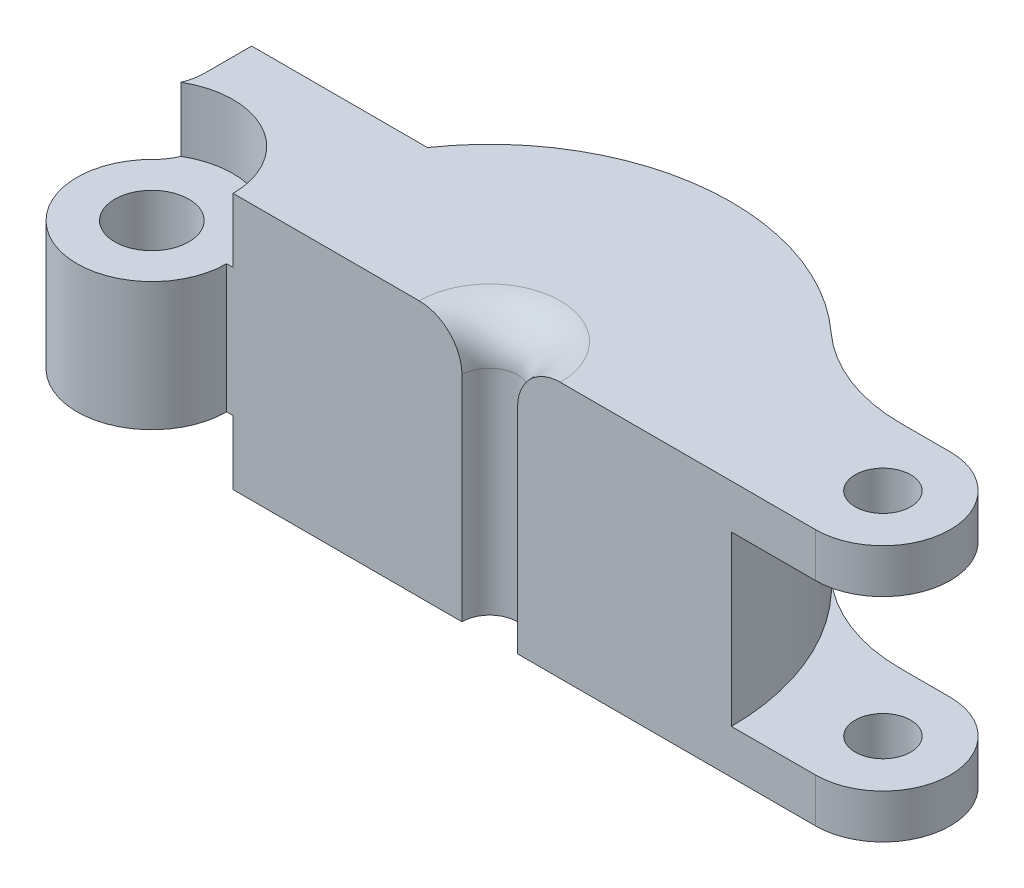
ISO-10303-21;
HEADER;
FILE_DESCRIPTION(('STEP AP214'),'2;1');
FILE_NAME('part.step','',(''),(''),'','','');
FILE_SCHEMA(('AUTOMOTIVE_DESIGN { 1 0 10303 214 1 1 1 1 }'));
ENDSEC;
DATA;
#1=APPLICATION_CONTEXT('core data for automotive mechanical design processes');
#2=APPLICATION_PROTOCOL_DEFINITION('international standard','automotive_design',2000,#1);
#3=PRODUCT_CONTEXT('',#1,'mechanical');
#4=PRODUCT('Part','Part','',(#3));
#5=PRODUCT_RELATED_PRODUCT_CATEGORY('part','',(#4));
#6=PRODUCT_DEFINITION_FORMATION('','',#4);
#7=PRODUCT_DEFINITION_CONTEXT('part definition',#1,'design');
#8=PRODUCT_DEFINITION('design','',#6,#7);
#9=PRODUCT_DEFINITION_SHAPE('','',#8);
#10=(LENGTH_UNIT() NAMED_UNIT(*) SI_UNIT(.MILLI.,.METRE.));
#11=(NAMED_UNIT(*) PLANE_ANGLE_UNIT() SI_UNIT($,.RADIAN.));
#12=(NAMED_UNIT(*) SI_UNIT($,.STERADIAN.) SOLID_ANGLE_UNIT());
#13=UNCERTAINTY_MEASURE_WITH_UNIT(LENGTH_MEASURE(1.E-05),#10,'distance_accuracy_value','');
#14=(GEOMETRIC_REPRESENTATION_CONTEXT(3) GLOBAL_UNCERTAINTY_ASSIGNED_CONTEXT((#13)) GLOBAL_UNIT_ASSIGNED_CONTEXT((#10,
#11,#12)) REPRESENTATION_CONTEXT('',''));
#15=CARTESIAN_POINT('',(0.,0.,0.));
#16=DIRECTION('',(0.,0.,1.));
#17=DIRECTION('',(1.,0.,0.));
#18=AXIS2_PLACEMENT_3D('',#15,#16,#17);
#19=CARTESIAN_POINT('',(19.351,15.24,-4.));
#20=DIRECTION('',(0.,-1.,0.));
#21=DIRECTION('',(0.,0.,-1.));
#22=AXIS2_PLACEMENT_3D('',#19,#20,#21);
#23=CYLINDRICAL_SURFACE('',#22,4.);
#24=CARTESIAN_POINT('',(19.351,2.62,-4.));
#25=DIRECTION('',(0.,1.,0.));
#26=DIRECTION('',(0.,0.,1.));
#27=AXIS2_PLACEMENT_3D('',#24,#25,#26);
#28=CIRCLE('',#27,4.);
#29=CARTESIAN_POINT('',(19.351,2.62,0.));
#30=VERTEX_POINT('',#29);
#31=CARTESIAN_POINT('',(19.351,2.62,-8.));
#32=VERTEX_POINT('',#31);
#33=EDGE_CURVE('E218',#30,#32,#28,.T.);
#34=ORIENTED_EDGE('',*,*,#33,.F.);
#35=DIRECTION('',(0.,-1.,0.));
#36=VECTOR('',#35,1.);
#37=CARTESIAN_POINT('',(19.351,15.24,0.));
#38=LINE('',#37,#36);
#39=CARTESIAN_POINT('',(19.351,0.,0.));
#40=VERTEX_POINT('',#39);
#41=EDGE_CURVE('E216',#30,#40,#38,.T.);
#42=ORIENTED_EDGE('',*,*,#41,.T.);
#43=CARTESIAN_POINT('',(19.351,0.,-4.));
#44=DIRECTION('',(0.,1.,0.));
#45=DIRECTION('',(0.,0.,1.));
#46=AXIS2_PLACEMENT_3D('',#43,#44,#45);
#47=CIRCLE('',#46,4.);
#48=CARTESIAN_POINT('',(19.351,0.,-8.));
#49=VERTEX_POINT('',#48);
#50=EDGE_CURVE('E302',#40,#49,#47,.T.);
#51=ORIENTED_EDGE('',*,*,#50,.T.);
#52=DIRECTION('',(0.,-1.,0.));
#53=VECTOR('',#52,1.);
#54=CARTESIAN_POINT('',(19.351,15.24,-8.));
#55=LINE('',#54,#53);
#56=EDGE_CURVE('E344',#32,#49,#55,.T.);
#57=ORIENTED_EDGE('',*,*,#56,.F.);
#58=EDGE_LOOP('',(#34,#42,#51,#57));
#59=FACE_BOUND('',#58,.T.);
#60=ADVANCED_FACE('F45',(#59),#23,.T.);
#61=CARTESIAN_POINT('',(0.,15.24,-8.));
#62=DIRECTION('',(0.,0.,1.));
#63=DIRECTION('',(1.,0.,0.));
#64=AXIS2_PLACEMENT_3D('',#61,#62,#63);
#65=PLANE('',#64);
#66=DIRECTION('',(-1.,0.,0.));
#67=VECTOR('',#66,1.);
#68=CARTESIAN_POINT('',(0.,0.,-8.));
#69=LINE('',#68,#67);
#70=CARTESIAN_POINT('',(16.4003414903471,0.,-8.));
#71=VERTEX_POINT('',#70);
#72=EDGE_CURVE('E306',#49,#71,#69,.T.);
#73=ORIENTED_EDGE('',*,*,#72,.T.);
#74=DIRECTION('',(0.,1.,0.));
#75=VECTOR('',#74,1.);
#76=CARTESIAN_POINT('',(16.4003414903471,2.62000000000001,-8.));
#77=LINE('',#76,#75);
#78=CARTESIAN_POINT('',(16.4003414903471,2.62,-8.));
#79=VERTEX_POINT('',#78);
#80=EDGE_CURVE('E419',#71,#79,#77,.T.);
#81=ORIENTED_EDGE('',*,*,#80,.T.);
#82=DIRECTION('',(-1.,0.,0.));
#83=VECTOR('',#82,1.);
#84=CARTESIAN_POINT('',(19.351,2.62,-8.));
#85=LINE('',#84,#83);
#86=EDGE_CURVE('E221',#32,#79,#85,.T.);
#87=ORIENTED_EDGE('',*,*,#86,.F.);
#88=ORIENTED_EDGE('',*,*,#56,.T.);
#89=EDGE_LOOP('',(#73,#81,#87,#88));
#90=FACE_BOUND('',#89,.T.);
#91=ADVANCED_FACE('F434',(#90),#65,.F.);
#92=CARTESIAN_POINT('',(19.351,15.24,-4.));
#93=DIRECTION('',(0.,-1.,0.));
#94=DIRECTION('',(0.,0.,-1.));
#95=AXIS2_PLACEMENT_3D('',#92,#93,#94);
#96=CYLINDRICAL_SURFACE('',#95,1.65);
#97=CARTESIAN_POINT('',(19.351,0.,-4.));
#98=DIRECTION('',(0.,1.,0.));
#99=DIRECTION('',(0.,0.,1.));
#100=AXIS2_PLACEMENT_3D('',#97,#98,#99);
#101=CIRCLE('',#100,1.65);
#102=CARTESIAN_POINT('',(19.351,0.,-5.65));
#103=VERTEX_POINT('',#102);
#104=EDGE_CURVE('E266',#103,#103,#101,.T.);
#105=CARTESIAN_POINT('',(19.351,2.62,-4.));
#106=DIRECTION('',(0.,1.,0.));
#107=DIRECTION('',(0.,0.,1.));
#108=AXIS2_PLACEMENT_3D('',#105,#106,#107);
#109=CIRCLE('',#108,1.65);
#110=CARTESIAN_POINT('',(19.351,2.62,-5.65));
#111=VERTEX_POINT('',#110);
#112=EDGE_CURVE('E200',#111,#111,#109,.T.);
#113=CARTESIAN_POINT('',(19.351,0.,-5.65));
#114=CARTESIAN_POINT('',(19.351,0.0272916666666668,-5.65));
#115=CARTESIAN_POINT('',(19.351,0.0545833333333336,-5.65));
#116=CARTESIAN_POINT('',(19.351,0.109166666666667,-5.65));
#117=CARTESIAN_POINT('',(19.351,0.136458333333334,-5.65));
#118=CARTESIAN_POINT('',(19.351,0.191041666666667,-5.65));
#119=CARTESIAN_POINT('',(19.351,0.218333333333333,-5.65));
#120=CARTESIAN_POINT('',(19.351,0.272916666666666,-5.65));
#121=CARTESIAN_POINT('',(19.351,0.300208333333333,-5.65));
#122=CARTESIAN_POINT('',(19.351,0.354791666666666,-5.65));
#123=CARTESIAN_POINT('',(19.351,0.382083333333333,-5.65));
#124=CARTESIAN_POINT('',(19.351,0.436666666666666,-5.65));
#125=CARTESIAN_POINT('',(19.351,0.463958333333332,-5.65));
#126=CARTESIAN_POINT('',(19.351,0.518541666666665,-5.65));
#127=CARTESIAN_POINT('',(19.351,0.545833333333332,-5.65));
#128=CARTESIAN_POINT('',(19.351,0.600416666666666,-5.65));
#129=CARTESIAN_POINT('',(19.351,0.627708333333333,-5.65));
#130=CARTESIAN_POINT('',(19.351,0.682291666666666,-5.65));
#131=CARTESIAN_POINT('',(19.351,0.709583333333333,-5.65));
#132=CARTESIAN_POINT('',(19.351,0.764166666666666,-5.65));
#133=CARTESIAN_POINT('',(19.351,0.791458333333333,-5.65));
#134=CARTESIAN_POINT('',(19.351,0.846041666666666,-5.65));
#135=CARTESIAN_POINT('',(19.351,0.873333333333332,-5.65));
#136=CARTESIAN_POINT('',(19.351,0.927916666666665,-5.65));
#137=CARTESIAN_POINT('',(19.351,0.955208333333332,-5.65));
#138=CARTESIAN_POINT('',(19.351,1.00979166666667,-5.65));
#139=CARTESIAN_POINT('',(19.351,1.03708333333333,-5.65));
#140=CARTESIAN_POINT('',(19.351,1.09166666666667,-5.65));
#141=CARTESIAN_POINT('',(19.351,1.11895833333333,-5.65));
#142=CARTESIAN_POINT('',(19.351,1.17354166666666,-5.65));
#143=CARTESIAN_POINT('',(19.351,1.20083333333333,-5.65));
#144=CARTESIAN_POINT('',(19.351,1.25541666666667,-5.65));
#145=CARTESIAN_POINT('',(19.351,1.28270833333333,-5.65));
#146=CARTESIAN_POINT('',(19.351,1.33729166666667,-5.65));
#147=CARTESIAN_POINT('',(19.351,1.36458333333333,-5.65));
#148=CARTESIAN_POINT('',(19.351,1.41916666666667,-5.65));
#149=CARTESIAN_POINT('',(19.351,1.44645833333333,-5.65));
#150=CARTESIAN_POINT('',(19.351,1.50104166666667,-5.65));
#151=CARTESIAN_POINT('',(19.351,1.52833333333333,-5.65));
#152=CARTESIAN_POINT('',(19.351,1.58291666666666,-5.65));
#153=CARTESIAN_POINT('',(19.351,1.61020833333333,-5.65));
#154=CARTESIAN_POINT('',(19.351,1.66479166666667,-5.65));
#155=CARTESIAN_POINT('',(19.351,1.69208333333333,-5.65));
#156=CARTESIAN_POINT('',(19.351,1.74666666666666,-5.65));
#157=CARTESIAN_POINT('',(19.351,1.77395833333333,-5.65));
#158=CARTESIAN_POINT('',(19.351,1.82854166666666,-5.65));
#159=CARTESIAN_POINT('',(19.351,1.85583333333333,-5.65));
#160=CARTESIAN_POINT('',(19.351,1.91041666666666,-5.65));
#161=CARTESIAN_POINT('',(19.351,1.93770833333333,-5.65));
#162=CARTESIAN_POINT('',(19.351,1.99229166666666,-5.65));
#163=CARTESIAN_POINT('',(19.351,2.01958333333333,-5.65));
#164=CARTESIAN_POINT('',(19.351,2.07416666666666,-5.65));
#165=CARTESIAN_POINT('',(19.351,2.10145833333333,-5.65));
#166=CARTESIAN_POINT('',(19.351,2.15604166666667,-5.65));
#167=CARTESIAN_POINT('',(19.351,2.18333333333333,-5.65));
#168=CARTESIAN_POINT('',(19.351,2.23791666666666,-5.65));
#169=CARTESIAN_POINT('',(19.351,2.26520833333333,-5.65));
#170=CARTESIAN_POINT('',(19.351,2.31979166666666,-5.65));
#171=CARTESIAN_POINT('',(19.351,2.34708333333333,-5.65));
#172=CARTESIAN_POINT('',(19.351,2.40166666666666,-5.65));
#173=CARTESIAN_POINT('',(19.351,2.42895833333333,-5.65));
#174=CARTESIAN_POINT('',(19.351,2.48354166666666,-5.65));
#175=CARTESIAN_POINT('',(19.351,2.51083333333333,-5.65));
#176=CARTESIAN_POINT('',(19.351,2.56541666666666,-5.65));
#177=CARTESIAN_POINT('',(19.351,2.59270833333333,-5.65));
#178=CARTESIAN_POINT('',(19.351,2.62,-5.65));
#179=B_SPLINE_CURVE_WITH_KNOTS('',3,(#113,#114,#115,#116,#117,#118,#119,#120,#121,#122,#123,
#124,#125,#126,#127,#128,#129,#130,#131,#132,#133,#134,#135,#136,#137,#138,#139,#140,#141,#142,
#143,#144,#145,#146,#147,#148,#149,#150,#151,#152,#153,#154,#155,#156,#157,#158,#159,#160,#161,
#162,#163,#164,#165,#166,#167,#168,#169,#170,#171,#172,#173,#174,#175,#176,#177,#178),
.UNSPECIFIED.,.F.,.F.,(4,2,2,2,2,2,2,2,2,2,2,2,2,2,2,2,2,2,2,2,2,2,2,2,2,2,2,2,2,2,2,2,4),(0.,
0.0818750000000004,0.163750000000001,0.245624999999999,0.3275,0.409375,0.491249999999999,
0.573124999999999,0.654999999999999,0.736875,0.81875,0.900624999999999,0.982499999999999,
1.064375,1.14625,1.228125,1.31,1.391875,1.47375,1.555625,1.6375,1.719375,1.80125,1.883125,1.965,
2.046875,2.12875,2.210625,2.2925,2.374375,2.45625,2.538125,2.62),.UNSPECIFIED.);
#180=EDGE_CURVE('BSEAM483',#103,#111,#179,.T.);
#181=ORIENTED_EDGE('',*,*,#104,.F.);
#182=ORIENTED_EDGE('',*,*,#112,.T.);
#183=ORIENTED_EDGE('',*,*,#180,.T.);
#184=ORIENTED_EDGE('',*,*,#180,.F.);
#185=EDGE_LOOP('',(#181,#183,#182,#184));
#186=FACE_BOUND('',#185,.T.);
#187=ADVANCED_FACE('F483',(#186),#96,.F.);
#188=CARTESIAN_POINT('',(-20.07,15.24,0.));
#189=DIRECTION('',(0.,-1.,0.));
#190=DIRECTION('',(0.,0.,-1.));
#191=AXIS2_PLACEMENT_3D('',#188,#189,#190);
#192=CYLINDRICAL_SURFACE('',#191,4.445);
#193=CARTESIAN_POINT('',(-20.07,11.43,0.));
#194=DIRECTION('',(0.,1.,0.));
#195=DIRECTION('',(0.,0.,1.));
#196=AXIS2_PLACEMENT_3D('',#193,#194,#195);
#197=CIRCLE('',#196,4.445);
#198=CARTESIAN_POINT('',(-23.1746339825386,11.43,-3.1810804508007));
#199=VERTEX_POINT('',#198);
#200=CARTESIAN_POINT('',(-15.625,11.43,0.));
#201=VERTEX_POINT('',#200);
#202=EDGE_CURVE('E263',#199,#201,#197,.T.);
#203=ORIENTED_EDGE('',*,*,#202,.F.);
#204=DIRECTION('',(0.,-1.,0.));
#205=VECTOR('',#204,1.);
#206=CARTESIAN_POINT('',(-23.1746339825386,15.24,-3.1810804508007));
#207=LINE('',#206,#205);
#208=CARTESIAN_POINT('',(-23.1746339825386,3.81,-3.1810804508007));
#209=VERTEX_POINT('',#208);
#210=EDGE_CURVE('E378',#199,#209,#207,.T.);
#211=ORIENTED_EDGE('',*,*,#210,.T.);
#212=CARTESIAN_POINT('',(-20.07,3.81,0.));
#213=DIRECTION('',(0.,-1.,0.));
#214=DIRECTION('',(0.,0.,-1.));
#215=AXIS2_PLACEMENT_3D('',#212,#213,#214);
#216=CIRCLE('',#215,4.445);
#217=CARTESIAN_POINT('',(-15.625,3.81,0.));
#218=VERTEX_POINT('',#217);
#219=EDGE_CURVE('E244',#218,#209,#216,.T.);
#220=ORIENTED_EDGE('',*,*,#219,.F.);
#221=DIRECTION('',(0.,-1.,0.));
#222=VECTOR('',#221,1.);
#223=CARTESIAN_POINT('',(-15.625,15.24,0.));
#224=LINE('',#223,#222);
#225=EDGE_CURVE('E332',#201,#218,#224,.T.);
#226=ORIENTED_EDGE('',*,*,#225,.F.);
#227=EDGE_LOOP('',(#203,#211,#220,#226));
#228=FACE_BOUND('',#227,.T.);
#229=ADVANCED_FACE('F522',(#228),#192,.T.);
#230=CARTESIAN_POINT('',(-20.07,15.24,0.));
#231=DIRECTION('',(0.,-1.,0.));
#232=DIRECTION('',(0.,0.,-1.));
#233=AXIS2_PLACEMENT_3D('',#230,#231,#232);
#234=CYLINDRICAL_SURFACE('',#233,2.2);
#235=CARTESIAN_POINT('',(-20.07,11.43,0.));
#236=DIRECTION('',(0.,1.,0.));
#237=DIRECTION('',(0.,0.,1.));
#238=AXIS2_PLACEMENT_3D('',#235,#236,#237);
#239=CIRCLE('',#238,2.2);
#240=CARTESIAN_POINT('',(-20.07,11.43,-2.2));
#241=VERTEX_POINT('',#240);
#242=EDGE_CURVE('E259',#241,#241,#239,.T.);
#243=CARTESIAN_POINT('',(-20.07,3.81,0.));
#244=DIRECTION('',(0.,-1.,0.));
#245=DIRECTION('',(0.,0.,-1.));
#246=AXIS2_PLACEMENT_3D('',#243,#244,#245);
#247=CIRCLE('',#246,2.2);
#248=CARTESIAN_POINT('',(-20.07,3.81,-2.2));
#249=VERTEX_POINT('',#248);
#250=EDGE_CURVE('E248',#249,#249,#247,.T.);
#251=CARTESIAN_POINT('',(-20.07,11.43,-2.2));
#252=CARTESIAN_POINT('',(-20.07,11.350625,-2.2));
#253=CARTESIAN_POINT('',(-20.07,11.27125,-2.2));
#254=CARTESIAN_POINT('',(-20.07,11.1125,-2.2));
#255=CARTESIAN_POINT('',(-20.07,11.033125,-2.2));
#256=CARTESIAN_POINT('',(-20.07,10.874375,-2.2));
#257=CARTESIAN_POINT('',(-20.07,10.795,-2.2));
#258=CARTESIAN_POINT('',(-20.07,10.63625,-2.2));
#259=CARTESIAN_POINT('',(-20.07,10.556875,-2.2));
#260=CARTESIAN_POINT('',(-20.07,10.398125,-2.2));
#261=CARTESIAN_POINT('',(-20.07,10.31875,-2.2));
#262=CARTESIAN_POINT('',(-20.07,10.16,-2.2));
#263=CARTESIAN_POINT('',(-20.07,10.080625,-2.2));
#264=CARTESIAN_POINT('',(-20.07,9.921875,-2.2));
#265=CARTESIAN_POINT('',(-20.07,9.8425,-2.2));
#266=CARTESIAN_POINT('',(-20.07,9.68375,-2.2));
#267=CARTESIAN_POINT('',(-20.07,9.604375,-2.2));
#268=CARTESIAN_POINT('',(-20.07,9.445625,-2.2));
#269=CARTESIAN_POINT('',(-20.07,9.36625,-2.2));
#270=CARTESIAN_POINT('',(-20.07,9.2075,-2.2));
#271=CARTESIAN_POINT('',(-20.07,9.128125,-2.2));
#272=CARTESIAN_POINT('',(-20.07,8.969375,-2.2));
#273=CARTESIAN_POINT('',(-20.07,8.89,-2.2));
#274=CARTESIAN_POINT('',(-20.07,8.73125,-2.2));
#275=CARTESIAN_POINT('',(-20.07,8.651875,-2.2));
#276=CARTESIAN_POINT('',(-20.07,8.493125,-2.2));
#277=CARTESIAN_POINT('',(-20.07,8.41375,-2.2));
#278=CARTESIAN_POINT('',(-20.07,8.255,-2.2));
#279=CARTESIAN_POINT('',(-20.07,8.175625,-2.2));
#280=CARTESIAN_POINT('',(-20.07,8.016875,-2.2));
#281=CARTESIAN_POINT('',(-20.07,7.9375,-2.2));
#282=CARTESIAN_POINT('',(-20.07,7.77875,-2.2));
#283=CARTESIAN_POINT('',(-20.07,7.699375,-2.2));
#284=CARTESIAN_POINT('',(-20.07,7.540625,-2.2));
#285=CARTESIAN_POINT('',(-20.07,7.46125,-2.2));
#286=CARTESIAN_POINT('',(-20.07,7.3025,-2.2));
#287=CARTESIAN_POINT('',(-20.07,7.223125,-2.2));
#288=CARTESIAN_POINT('',(-20.07,7.064375,-2.2));
#289=CARTESIAN_POINT('',(-20.07,6.985,-2.2));
#290=CARTESIAN_POINT('',(-20.07,6.82625,-2.2));
#291=CARTESIAN_POINT('',(-20.07,6.746875,-2.2));
#292=CARTESIAN_POINT('',(-20.07,6.588125,-2.2));
#293=CARTESIAN_POINT('',(-20.07,6.50875,-2.2));
#294=CARTESIAN_POINT('',(-20.07,6.35,-2.2));
#295=CARTESIAN_POINT('',(-20.07,6.270625,-2.2));
#296=CARTESIAN_POINT('',(-20.07,6.111875,-2.2));
#297=CARTESIAN_POINT('',(-20.07,6.0325,-2.2));
#298=CARTESIAN_POINT('',(-20.07,5.87375,-2.2));
#299=CARTESIAN_POINT('',(-20.07,5.794375,-2.2));
#300=CARTESIAN_POINT('',(-20.07,5.635625,-2.2));
#301=CARTESIAN_POINT('',(-20.07,5.55625,-2.2));
#302=CARTESIAN_POINT('',(-20.07,5.3975,-2.2));
#303=CARTESIAN_POINT('',(-20.07,5.318125,-2.2));
#304=CARTESIAN_POINT('',(-20.07,5.159375,-2.2));
#305=CARTESIAN_POINT('',(-20.07,5.08,-2.2));
#306=CARTESIAN_POINT('',(-20.07,4.92125,-2.2));
#307=CARTESIAN_POINT('',(-20.07,4.841875,-2.2));
#308=CARTESIAN_POINT('',(-20.07,4.683125,-2.2));
#309=CARTESIAN_POINT('',(-20.07,4.60375,-2.2));
#310=CARTESIAN_POINT('',(-20.07,4.445,-2.2));
#311=CARTESIAN_POINT('',(-20.07,4.365625,-2.2));
#312=CARTESIAN_POINT('',(-20.07,4.206875,-2.2));
#313=CARTESIAN_POINT('',(-20.07,4.1275,-2.2));
#314=CARTESIAN_POINT('',(-20.07,3.96875,-2.2));
#315=CARTESIAN_POINT('',(-20.07,3.889375,-2.2));
#316=CARTESIAN_POINT('',(-20.07,3.81,-2.2));
#317=B_SPLINE_CURVE_WITH_KNOTS('',3,(#251,#252,#253,#254,#255,#256,#257,#258,#259,#260,#261,
#262,#263,#264,#265,#266,#267,#268,#269,#270,#271,#272,#273,#274,#275,#276,#277,#278,#279,#280,
#281,#282,#283,#284,#285,#286,#287,#288,#289,#290,#291,#292,#293,#294,#295,#296,#297,#298,#299,
#300,#301,#302,#303,#304,#305,#306,#307,#308,#309,#310,#311,#312,#313,#314,#315,#316),
.UNSPECIFIED.,.F.,.F.,(4,2,2,2,2,2,2,2,2,2,2,2,2,2,2,2,2,2,2,2,2,2,2,2,2,2,2,2,2,2,2,2,4),(0.,
0.238124999999999,0.476249999999999,0.714374999999998,0.9525,1.190625,1.42875,1.666875,1.905,
2.143125,2.38125,2.619375,2.8575,3.095625,3.33375,3.571875,3.81,4.048125,4.28625,4.524375,
4.7625,5.000625,5.23875,5.476875,5.715,5.953125,6.19125,6.429375,6.6675,6.905625,7.14375,
7.381875,7.62),.UNSPECIFIED.);
#318=EDGE_CURVE('BSEAM552',#241,#249,#317,.T.);
#319=ORIENTED_EDGE('',*,*,#242,.T.);
#320=ORIENTED_EDGE('',*,*,#250,.T.);
#321=ORIENTED_EDGE('',*,*,#318,.T.);
#322=ORIENTED_EDGE('',*,*,#318,.F.);
#323=EDGE_LOOP('',(#319,#321,#320,#322));
#324=FACE_BOUND('',#323,.T.);
#325=ADVANCED_FACE('F552',(#324),#234,.F.);
#326=CARTESIAN_POINT('',(-22.27,15.24,0.));
#327=DIRECTION('',(1.,0.,0.));
#328=DIRECTION('',(0.,0.,-1.));
#329=AXIS2_PLACEMENT_3D('',#326,#327,#328);
#330=PLANE('',#329);
#331=DIRECTION('',(0.,0.,1.));
#332=VECTOR('',#331,1.);
#333=CARTESIAN_POINT('',(-22.27,0.,0.));
#334=LINE('',#333,#332);
#335=CARTESIAN_POINT('',(-22.27,0.,-8.128));
#336=VERTEX_POINT('',#335);
#337=CARTESIAN_POINT('',(-22.27,0.,-5.32804138497441));
#338=VERTEX_POINT('',#337);
#339=EDGE_CURVE('E316',#336,#338,#334,.T.);
#340=ORIENTED_EDGE('',*,*,#339,.T.);
#341=DIRECTION('',(0.,1.,0.));
#342=VECTOR('',#341,1.);
#343=CARTESIAN_POINT('',(-22.27,11.43,-5.32804138497441));
#344=LINE('',#343,#342);
#345=CARTESIAN_POINT('',(-22.27,15.24,-5.32804138497441));
#346=VERTEX_POINT('',#345);
#347=EDGE_CURVE('E382',#338,#346,#344,.T.);
#348=ORIENTED_EDGE('',*,*,#347,.T.);
#349=DIRECTION('',(0.,0.,1.));
#350=VECTOR('',#349,1.);
#351=CARTESIAN_POINT('',(-22.27,15.24,0.));
#352=LINE('',#351,#350);
#353=CARTESIAN_POINT('',(-22.27,15.24,-8.128));
#354=VERTEX_POINT('',#353);
#355=EDGE_CURVE('E287',#354,#346,#352,.T.);
#356=ORIENTED_EDGE('',*,*,#355,.F.);
#357=DIRECTION('',(0.,-1.,0.));
#358=VECTOR('',#357,1.);
#359=CARTESIAN_POINT('',(-22.27,15.24,-8.128));
#360=LINE('',#359,#358);
#361=EDGE_CURVE('E336',#354,#336,#360,.T.);
#362=ORIENTED_EDGE('',*,*,#361,.T.);
#363=EDGE_LOOP('',(#340,#348,#356,#362));
#364=FACE_BOUND('',#363,.T.);
#365=ADVANCED_FACE('F457',(#364),#330,.F.);
#366=CARTESIAN_POINT('',(0.,15.24,0.));
#367=DIRECTION('',(0.,0.,-1.));
#368=DIRECTION('',(-1.,0.,0.));
#369=AXIS2_PLACEMENT_3D('',#366,#367,#368);
#370=PLANE('',#369);
#371=DIRECTION('',(0.,-1.,0.));
#372=VECTOR('',#371,1.);
#373=CARTESIAN_POINT('',(-15.244,3.81,0.));
#374=LINE('',#373,#372);
#375=CARTESIAN_POINT('',(-15.244,0.,0.));
#376=VERTEX_POINT('',#375);
#377=CARTESIAN_POINT('',(-15.244,3.81,0.));
#378=VERTEX_POINT('',#377);
#379=EDGE_CURVE('E240',#376,#378,#374,.F.);
#380=ORIENTED_EDGE('',*,*,#379,.F.);
#381=DIRECTION('',(1.,0.,0.));
#382=VECTOR('',#381,1.);
#383=CARTESIAN_POINT('',(0.,0.,0.));
#384=LINE('',#383,#382);
#385=CARTESIAN_POINT('',(-1.651,0.,0.));
#386=VERTEX_POINT('',#385);
#387=EDGE_CURVE('E320',#376,#386,#384,.T.);
#388=ORIENTED_EDGE('',*,*,#387,.T.);
#389=DIRECTION('',(0.,-1.,0.));
#390=VECTOR('',#389,1.);
#391=CARTESIAN_POINT('',(-1.651,15.24,0.));
#392=LINE('',#391,#390);
#393=CARTESIAN_POINT('',(-1.651,12.7,0.));
#394=VERTEX_POINT('',#393);
#395=EDGE_CURVE('E328',#394,#386,#392,.T.);
#396=ORIENTED_EDGE('',*,*,#395,.F.);
#397=CARTESIAN_POINT('',(-4.191,12.7,0.));
#398=DIRECTION('',(0.,0.,-1.));
#399=DIRECTION('',(-1.,0.,0.));
#400=AXIS2_PLACEMENT_3D('',#397,#398,#399);
#401=CIRCLE('',#400,2.54);
#402=CARTESIAN_POINT('',(-4.191,15.24,0.));
#403=VERTEX_POINT('',#402);
#404=EDGE_CURVE('E363',#394,#403,#401,.F.);
#405=ORIENTED_EDGE('',*,*,#404,.T.);
#406=DIRECTION('',(1.,0.,0.));
#407=VECTOR('',#406,1.);
#408=CARTESIAN_POINT('',(0.,15.24,0.));
#409=LINE('',#408,#407);
#410=CARTESIAN_POINT('',(-15.244,15.24,0.));
#411=VERTEX_POINT('',#410);
#412=EDGE_CURVE('E291',#411,#403,#409,.T.);
#413=ORIENTED_EDGE('',*,*,#412,.F.);
#414=DIRECTION('',(0.,1.,0.));
#415=VECTOR('',#414,1.);
#416=CARTESIAN_POINT('',(-15.244,11.43,0.));
#417=LINE('',#416,#415);
#418=CARTESIAN_POINT('',(-15.244,11.43,0.));
#419=VERTEX_POINT('',#418);
#420=EDGE_CURVE('E255',#411,#419,#417,.F.);
#421=ORIENTED_EDGE('',*,*,#420,.T.);
#422=DIRECTION('',(1.,0.,0.));
#423=VECTOR('',#422,1.);
#424=CARTESIAN_POINT('',(0.,11.43,0.));
#425=LINE('',#424,#423);
#426=EDGE_CURVE('E260',#201,#419,#425,.T.);
#427=ORIENTED_EDGE('',*,*,#426,.F.);
#428=ORIENTED_EDGE('',*,*,#225,.T.);
#429=DIRECTION('',(-1.,0.,0.));
#430=VECTOR('',#429,1.);
#431=CARTESIAN_POINT('',(0.,3.81,0.));
#432=LINE('',#431,#430);
#433=EDGE_CURVE('E375',#378,#218,#432,.T.);
#434=ORIENTED_EDGE('',*,*,#433,.F.);
#435=EDGE_LOOP('',(#380,#388,#396,#405,#413,#421,#427,#428,#434));
#436=FACE_BOUND('',#435,.T.);
#437=ADVANCED_FACE('F493',(#436),#370,.F.);
#438=CARTESIAN_POINT('',(0.,15.24,0.));
#439=DIRECTION('',(0.,0.,-1.));
#440=DIRECTION('',(-1.,0.,0.));
#441=AXIS2_PLACEMENT_3D('',#438,#439,#440);
#442=PLANE('',#441);
#443=DIRECTION('',(0.,-1.,0.));
#444=VECTOR('',#443,1.);
#445=CARTESIAN_POINT('',(14.351,12.62,0.));
#446=LINE('',#445,#444);
#447=CARTESIAN_POINT('',(14.351,12.62,0.));
#448=VERTEX_POINT('',#447);
#449=CARTESIAN_POINT('',(14.351,2.62,0.));
#450=VERTEX_POINT('',#449);
#451=EDGE_CURVE('E188',#448,#450,#446,.T.);
#452=ORIENTED_EDGE('',*,*,#451,.F.);
#453=DIRECTION('',(1.,0.,0.));
#454=VECTOR('',#453,1.);
#455=CARTESIAN_POINT('',(14.351,12.62,0.));
#456=LINE('',#455,#454);
#457=CARTESIAN_POINT('',(19.351,12.62,0.));
#458=VERTEX_POINT('',#457);
#459=EDGE_CURVE('E228',#448,#458,#456,.T.);
#460=ORIENTED_EDGE('',*,*,#459,.T.);
#461=CARTESIAN_POINT('',(19.351,15.24,0.));
#462=VERTEX_POINT('',#461);
#463=EDGE_CURVE('E349',#462,#458,#38,.T.);
#464=ORIENTED_EDGE('',*,*,#463,.F.);
#465=DIRECTION('',(1.,0.,0.));
#466=VECTOR('',#465,1.);
#467=CARTESIAN_POINT('',(0.,15.24,0.));
#468=LINE('',#467,#466);
#469=CARTESIAN_POINT('',(4.191,15.24,0.));
#470=VERTEX_POINT('',#469);
#471=EDGE_CURVE('E271',#470,#462,#468,.T.);
#472=ORIENTED_EDGE('',*,*,#471,.F.);
#473=CARTESIAN_POINT('',(4.191,12.7,0.));
#474=DIRECTION('',(0.,0.,-1.));
#475=DIRECTION('',(-1.,0.,0.));
#476=AXIS2_PLACEMENT_3D('',#473,#474,#475);
#477=CIRCLE('',#476,2.54);
#478=CARTESIAN_POINT('',(1.651,12.7,0.));
#479=VERTEX_POINT('',#478);
#480=EDGE_CURVE('E369',#470,#479,#477,.F.);
#481=ORIENTED_EDGE('',*,*,#480,.T.);
#482=DIRECTION('',(0.,-1.,0.));
#483=VECTOR('',#482,1.);
#484=CARTESIAN_POINT('',(1.651,15.24,0.));
#485=LINE('',#484,#483);
#486=CARTESIAN_POINT('',(1.651,0.,0.));
#487=VERTEX_POINT('',#486);
#488=EDGE_CURVE('E295',#479,#487,#485,.T.);
#489=ORIENTED_EDGE('',*,*,#488,.T.);
#490=DIRECTION('',(1.,0.,0.));
#491=VECTOR('',#490,1.);
#492=CARTESIAN_POINT('',(0.,0.,0.));
#493=LINE('',#492,#491);
#494=EDGE_CURVE('E299',#487,#40,#493,.T.);
#495=ORIENTED_EDGE('',*,*,#494,.T.);
#496=ORIENTED_EDGE('',*,*,#41,.F.);
#497=DIRECTION('',(1.,0.,0.));
#498=VECTOR('',#497,1.);
#499=CARTESIAN_POINT('',(14.351,2.62,0.));
#500=LINE('',#499,#498);
#501=EDGE_CURVE('E205',#450,#30,#500,.T.);
#502=ORIENTED_EDGE('',*,*,#501,.F.);
#503=EDGE_LOOP('',(#452,#460,#464,#472,#481,#489,#495,#496,#502));
#504=FACE_BOUND('',#503,.T.);
#505=ADVANCED_FACE('F214',(#504),#442,.F.);
#506=ORIENTED_EDGE('',*,*,#463,.T.);
#507=CARTESIAN_POINT('',(19.351,12.62,-4.));
#508=DIRECTION('',(0.,1.,0.));
#509=DIRECTION('',(0.,0.,1.));
#510=AXIS2_PLACEMENT_3D('',#507,#508,#509);
#511=CIRCLE('',#510,4.);
#512=CARTESIAN_POINT('',(19.351,12.62,-8.));
#513=VERTEX_POINT('',#512);
#514=EDGE_CURVE('E231',#458,#513,#511,.T.);
#515=ORIENTED_EDGE('',*,*,#514,.T.);
#516=CARTESIAN_POINT('',(19.351,15.24,-8.));
#517=VERTEX_POINT('',#516);
#518=EDGE_CURVE('E345',#517,#513,#55,.T.);
#519=ORIENTED_EDGE('',*,*,#518,.F.);
#520=CARTESIAN_POINT('',(19.351,15.24,-4.));
#521=DIRECTION('',(0.,1.,0.));
#522=DIRECTION('',(0.,0.,1.));
#523=AXIS2_PLACEMENT_3D('',#520,#521,#522);
#524=CIRCLE('',#523,4.);
#525=EDGE_CURVE('E275',#462,#517,#524,.T.);
#526=ORIENTED_EDGE('',*,*,#525,.F.);
#527=EDGE_LOOP('',(#506,#515,#519,#526));
#528=FACE_BOUND('',#527,.T.);
#529=ADVANCED_FACE('F479',(#528),#23,.T.);
#530=DIRECTION('',(-1.,0.,0.));
#531=VECTOR('',#530,1.);
#532=CARTESIAN_POINT('',(19.351,12.62,-8.));
#533=LINE('',#532,#531);
#534=CARTESIAN_POINT('',(16.4003414903471,12.62,-8.));
#535=VERTEX_POINT('',#534);
#536=EDGE_CURVE('E201',#513,#535,#533,.T.);
#537=ORIENTED_EDGE('',*,*,#536,.T.);
#538=DIRECTION('',(0.,1.,0.));
#539=VECTOR('',#538,1.);
#540=CARTESIAN_POINT('',(16.4003414903471,15.24,-8.));
#541=LINE('',#540,#539);
#542=CARTESIAN_POINT('',(16.4003414903471,15.24,-8.));
#543=VERTEX_POINT('',#542);
#544=EDGE_CURVE('E61',#535,#543,#541,.T.);
#545=ORIENTED_EDGE('',*,*,#544,.T.);
#546=DIRECTION('',(-1.,0.,0.));
#547=VECTOR('',#546,1.);
#548=CARTESIAN_POINT('',(0.,15.24,-8.));
#549=LINE('',#548,#547);
#550=EDGE_CURVE('E278',#517,#543,#549,.T.);
#551=ORIENTED_EDGE('',*,*,#550,.F.);
#552=ORIENTED_EDGE('',*,*,#518,.T.);
#553=EDGE_LOOP('',(#537,#545,#551,#552));
#554=FACE_BOUND('',#553,.T.);
#555=ADVANCED_FACE('F485',(#554),#65,.F.);
#556=CARTESIAN_POINT('',(0.,15.24,0.));
#557=DIRECTION('',(0.,-1.,0.));
#558=DIRECTION('',(0.,0.,-1.));
#559=AXIS2_PLACEMENT_3D('',#556,#557,#558);
#560=CYLINDRICAL_SURFACE('',#559,14.351);
#561=CARTESIAN_POINT('',(0.,2.62,0.));
#562=DIRECTION('',(0.,-1.,0.));
#563=DIRECTION('',(0.,0.,1.));
#564=AXIS2_PLACEMENT_3D('',#561,#562,#563);
#565=CIRCLE('',#564,14.351);
#566=CARTESIAN_POINT('',(9.66536490197409,2.62,-10.6081064432672));
#567=VERTEX_POINT('',#566);
#568=EDGE_CURVE('E192',#567,#450,#565,.T.);
#569=ORIENTED_EDGE('',*,*,#568,.F.);
#570=DIRECTION('',(0.,-1.,0.));
#571=VECTOR('',#570,1.);
#572=CARTESIAN_POINT('',(9.66536490197409,15.24,-10.6081064432672));
#573=LINE('',#572,#571);
#574=CARTESIAN_POINT('',(9.66536490197409,0.,-10.6081064432672));
#575=VERTEX_POINT('',#574);
#576=EDGE_CURVE('E416',#567,#575,#573,.T.);
#577=ORIENTED_EDGE('',*,*,#576,.T.);
#578=CARTESIAN_POINT('',(0.,0.,0.));
#579=DIRECTION('',(0.,1.,0.));
#580=DIRECTION('',(0.,0.,1.));
#581=AXIS2_PLACEMENT_3D('',#578,#579,#580);
#582=CIRCLE('',#581,14.351);
#583=CARTESIAN_POINT('',(-11.8273757444329,0.,-8.128));
#584=VERTEX_POINT('',#583);
#585=EDGE_CURVE('E310',#575,#584,#582,.T.);
#586=ORIENTED_EDGE('',*,*,#585,.T.);
#587=DIRECTION('',(0.,-1.,0.));
#588=VECTOR('',#587,1.);
#589=CARTESIAN_POINT('',(-11.8273757444329,15.24,-8.128));
#590=LINE('',#589,#588);
#591=CARTESIAN_POINT('',(-11.8273757444329,15.24,-8.128));
#592=VERTEX_POINT('',#591);
#593=EDGE_CURVE('E340',#592,#584,#590,.T.);
#594=ORIENTED_EDGE('',*,*,#593,.F.);
#595=CARTESIAN_POINT('',(0.,15.24,0.));
#596=DIRECTION('',(0.,1.,0.));
#597=DIRECTION('',(0.,0.,1.));
#598=AXIS2_PLACEMENT_3D('',#595,#596,#597);
#599=CIRCLE('',#598,14.351);
#600=CARTESIAN_POINT('',(9.66536490197409,15.24,-10.6081064432672));
#601=VERTEX_POINT('',#600);
#602=EDGE_CURVE('E281',#601,#592,#599,.T.);
#603=ORIENTED_EDGE('',*,*,#602,.F.);
#604=DIRECTION('',(0.,-1.,0.));
#605=VECTOR('',#604,1.);
#606=CARTESIAN_POINT('',(9.66536490197409,15.24,-10.6081064432672));
#607=LINE('',#606,#605);
#608=CARTESIAN_POINT('',(9.66536490197409,12.62,-10.6081064432672));
#609=VERTEX_POINT('',#608);
#610=EDGE_CURVE('E407',#601,#609,#607,.T.);
#611=ORIENTED_EDGE('',*,*,#610,.T.);
#612=CARTESIAN_POINT('',(0.,12.62,0.));
#613=DIRECTION('',(0.,-1.,0.));
#614=DIRECTION('',(0.,0.,1.));
#615=AXIS2_PLACEMENT_3D('',#612,#613,#614);
#616=CIRCLE('',#615,14.351);
#617=EDGE_CURVE('E195',#609,#448,#616,.T.);
#618=ORIENTED_EDGE('',*,*,#617,.T.);
#619=ORIENTED_EDGE('',*,*,#451,.T.);
#620=EDGE_LOOP('',(#569,#577,#586,#594,#603,#611,#618,#619));
#621=FACE_BOUND('',#620,.T.);
#622=ADVANCED_FACE('F190',(#621),#560,.T.);
#623=CARTESIAN_POINT('',(0.,15.24,-8.128));
#624=DIRECTION('',(0.,0.,1.));
#625=DIRECTION('',(1.,0.,0.));
#626=AXIS2_PLACEMENT_3D('',#623,#624,#625);
#627=PLANE('',#626);
#628=DIRECTION('',(-1.,0.,0.));
#629=VECTOR('',#628,1.);
#630=CARTESIAN_POINT('',(0.,0.,-8.128));
#631=LINE('',#630,#629);
#632=EDGE_CURVE('E313',#584,#336,#631,.T.);
#633=ORIENTED_EDGE('',*,*,#632,.T.);
#634=ORIENTED_EDGE('',*,*,#361,.F.);
#635=DIRECTION('',(-1.,0.,0.));
#636=VECTOR('',#635,1.);
#637=CARTESIAN_POINT('',(0.,15.24,-8.128));
#638=LINE('',#637,#636);
#639=EDGE_CURVE('E284',#592,#354,#638,.T.);
#640=ORIENTED_EDGE('',*,*,#639,.F.);
#641=ORIENTED_EDGE('',*,*,#593,.T.);
#642=EDGE_LOOP('',(#633,#634,#640,#641));
#643=FACE_BOUND('',#642,.T.);
#644=ADVANCED_FACE('F451',(#643),#627,.F.);
#645=CARTESIAN_POINT('',(19.351,12.62,-4.));
#646=DIRECTION('',(0.,1.,0.));
#647=DIRECTION('',(0.,0.,1.));
#648=AXIS2_PLACEMENT_3D('',#645,#646,#647);
#649=CIRCLE('',#648,1.65);
#650=CARTESIAN_POINT('',(19.351,12.62,-5.65));
#651=VERTEX_POINT('',#650);
#652=EDGE_CURVE('E241',#651,#651,#649,.T.);
#653=CARTESIAN_POINT('',(19.351,15.24,-4.));
#654=DIRECTION('',(0.,1.,0.));
#655=DIRECTION('',(0.,0.,1.));
#656=AXIS2_PLACEMENT_3D('',#653,#654,#655);
#657=CIRCLE('',#656,1.65);
#658=CARTESIAN_POINT('',(19.351,15.24,-5.65));
#659=VERTEX_POINT('',#658);
#660=EDGE_CURVE('E267',#659,#659,#657,.T.);
#661=CARTESIAN_POINT('',(19.351,12.62,-5.65));
#662=CARTESIAN_POINT('',(19.351,12.6472916666667,-5.65));
#663=CARTESIAN_POINT('',(19.351,12.6745833333333,-5.65));
#664=CARTESIAN_POINT('',(19.351,12.7291666666667,-5.65));
#665=CARTESIAN_POINT('',(19.351,12.7564583333333,-5.65));
#666=CARTESIAN_POINT('',(19.351,12.8110416666667,-5.65));
#667=CARTESIAN_POINT('',(19.351,12.8383333333333,-5.65));
#668=CARTESIAN_POINT('',(19.351,12.8929166666667,-5.65));
#669=CARTESIAN_POINT('',(19.351,12.9202083333333,-5.65));
#670=CARTESIAN_POINT('',(19.351,12.9747916666667,-5.65));
#671=CARTESIAN_POINT('',(19.351,13.0020833333333,-5.65));
#672=CARTESIAN_POINT('',(19.351,13.0566666666667,-5.65));
#673=CARTESIAN_POINT('',(19.351,13.0839583333333,-5.65));
#674=CARTESIAN_POINT('',(19.351,13.1385416666667,-5.65));
#675=CARTESIAN_POINT('',(19.351,13.1658333333333,-5.65));
#676=CARTESIAN_POINT('',(19.351,13.2204166666667,-5.65));
#677=CARTESIAN_POINT('',(19.351,13.2477083333333,-5.65));
#678=CARTESIAN_POINT('',(19.351,13.3022916666667,-5.65));
#679=CARTESIAN_POINT('',(19.351,13.3295833333333,-5.65));
#680=CARTESIAN_POINT('',(19.351,13.3841666666667,-5.65));
#681=CARTESIAN_POINT('',(19.351,13.4114583333333,-5.65));
#682=CARTESIAN_POINT('',(19.351,13.4660416666667,-5.65));
#683=CARTESIAN_POINT('',(19.351,13.4933333333333,-5.65));
#684=CARTESIAN_POINT('',(19.351,13.5479166666667,-5.65));
#685=CARTESIAN_POINT('',(19.351,13.5752083333333,-5.65));
#686=CARTESIAN_POINT('',(19.351,13.6297916666667,-5.65));
#687=CARTESIAN_POINT('',(19.351,13.6570833333333,-5.65));
#688=CARTESIAN_POINT('',(19.351,13.7116666666667,-5.65));
#689=CARTESIAN_POINT('',(19.351,13.7389583333333,-5.65));
#690=CARTESIAN_POINT('',(19.351,13.7935416666667,-5.65));
#691=CARTESIAN_POINT('',(19.351,13.8208333333333,-5.65));
#692=CARTESIAN_POINT('',(19.351,13.8754166666667,-5.65));
#693=CARTESIAN_POINT('',(19.351,13.9027083333333,-5.65));
#694=CARTESIAN_POINT('',(19.351,13.9572916666667,-5.65));
#695=CARTESIAN_POINT('',(19.351,13.9845833333333,-5.65));
#696=CARTESIAN_POINT('',(19.351,14.0391666666667,-5.65));
#697=CARTESIAN_POINT('',(19.351,14.0664583333333,-5.65));
#698=CARTESIAN_POINT('',(19.351,14.1210416666667,-5.65));
#699=CARTESIAN_POINT('',(19.351,14.1483333333333,-5.65));
#700=CARTESIAN_POINT('',(19.351,14.2029166666667,-5.65));
#701=CARTESIAN_POINT('',(19.351,14.2302083333333,-5.65));
#702=CARTESIAN_POINT('',(19.351,14.2847916666667,-5.65));
#703=CARTESIAN_POINT('',(19.351,14.3120833333333,-5.65));
#704=CARTESIAN_POINT('',(19.351,14.3666666666667,-5.65));
#705=CARTESIAN_POINT('',(19.351,14.3939583333333,-5.65));
#706=CARTESIAN_POINT('',(19.351,14.4485416666667,-5.65));
#707=CARTESIAN_POINT('',(19.351,14.4758333333333,-5.65));
#708=CARTESIAN_POINT('',(19.351,14.5304166666667,-5.65));
#709=CARTESIAN_POINT('',(19.351,14.5577083333333,-5.65));
#710=CARTESIAN_POINT('',(19.351,14.6122916666667,-5.65));
#711=CARTESIAN_POINT('',(19.351,14.6395833333333,-5.65));
#712=CARTESIAN_POINT('',(19.351,14.6941666666667,-5.65));
#713=CARTESIAN_POINT('',(19.351,14.7214583333333,-5.65));
#714=CARTESIAN_POINT('',(19.351,14.7760416666667,-5.65));
#715=CARTESIAN_POINT('',(19.351,14.8033333333333,-5.65));
#716=CARTESIAN_POINT('',(19.351,14.8579166666667,-5.65));
#717=CARTESIAN_POINT('',(19.351,14.8852083333333,-5.65));
#718=CARTESIAN_POINT('',(19.351,14.9397916666667,-5.65));
#719=CARTESIAN_POINT('',(19.351,14.9670833333333,-5.65));
#720=CARTESIAN_POINT('',(19.351,15.0216666666667,-5.65));
#721=CARTESIAN_POINT('',(19.351,15.0489583333333,-5.65));
#722=CARTESIAN_POINT('',(19.351,15.1035416666667,-5.65));
#723=CARTESIAN_POINT('',(19.351,15.1308333333333,-5.65));
#724=CARTESIAN_POINT('',(19.351,15.1854166666667,-5.65));
#725=CARTESIAN_POINT('',(19.351,15.2127083333333,-5.65));
#726=CARTESIAN_POINT('',(19.351,15.24,-5.65));
#727=B_SPLINE_CURVE_WITH_KNOTS('',3,(#661,#662,#663,#664,#665,#666,#667,#668,#669,#670,#671,
#672,#673,#674,#675,#676,#677,#678,#679,#680,#681,#682,#683,#684,#685,#686,#687,#688,#689,#690,
#691,#692,#693,#694,#695,#696,#697,#698,#699,#700,#701,#702,#703,#704,#705,#706,#707,#708,#709,
#710,#711,#712,#713,#714,#715,#716,#717,#718,#719,#720,#721,#722,#723,#724,#725,#726),
.UNSPECIFIED.,.F.,.F.,(4,2,2,2,2,2,2,2,2,2,2,2,2,2,2,2,2,2,2,2,2,2,2,2,2,2,2,2,2,2,2,2,4),(0.,
0.0818750000000004,0.163750000000001,0.245625000000001,0.3275,0.409375,0.49125,
0.573125000000001,0.655000000000001,0.736875,0.81875,0.900625,0.982500000000001,1.064375,
1.14625,1.228125,1.31,1.391875,1.47375,1.555625,1.6375,1.719375,1.80125,1.883125,1.965,2.046875,
2.12875,2.210625,2.2925,2.374375,2.45625,2.538125,2.62),.UNSPECIFIED.);
#728=EDGE_CURVE('BSEAM547',#651,#659,#727,.T.);
#729=ORIENTED_EDGE('',*,*,#652,.F.);
#730=ORIENTED_EDGE('',*,*,#660,.T.);
#731=ORIENTED_EDGE('',*,*,#728,.T.);
#732=ORIENTED_EDGE('',*,*,#728,.F.);
#733=EDGE_LOOP('',(#729,#731,#730,#732));
#734=FACE_BOUND('',#733,.T.);
#735=ADVANCED_FACE('F547',(#734),#96,.F.);
#736=CARTESIAN_POINT('',(0.,15.24,0.));
#737=DIRECTION('',(0.,-1.,0.));
#738=DIRECTION('',(0.,0.,-1.));
#739=AXIS2_PLACEMENT_3D('',#736,#737,#738);
#740=CYLINDRICAL_SURFACE('',#739,1.651);
#741=ORIENTED_EDGE('',*,*,#488,.F.);
#742=CARTESIAN_POINT('',(0.,12.7,0.));
#743=DIRECTION('',(0.,1.,0.));
#744=DIRECTION('',(0.,0.,1.));
#745=AXIS2_PLACEMENT_3D('',#742,#743,#744);
#746=CIRCLE('',#745,1.651);
#747=EDGE_CURVE('E356',#479,#394,#746,.T.);
#748=ORIENTED_EDGE('',*,*,#747,.T.);
#749=ORIENTED_EDGE('',*,*,#395,.T.);
#750=CARTESIAN_POINT('',(0.,0.,0.));
#751=DIRECTION('',(0.,1.,0.));
#752=DIRECTION('',(0.,0.,1.));
#753=AXIS2_PLACEMENT_3D('',#750,#751,#752);
#754=CIRCLE('',#753,1.651);
#755=EDGE_CURVE('E272',#487,#386,#754,.T.);
#756=ORIENTED_EDGE('',*,*,#755,.F.);
#757=EDGE_LOOP('',(#741,#748,#749,#756));
#758=FACE_BOUND('',#757,.T.);
#759=ADVANCED_FACE('F507',(#758),#740,.F.);
#760=CARTESIAN_POINT('',(0.,15.24,0.));
#761=DIRECTION('',(0.,1.,0.));
#762=DIRECTION('',(0.,0.,1.));
#763=AXIS2_PLACEMENT_3D('',#760,#761,#762);
#764=PLANE('',#763);
#765=ORIENTED_EDGE('',*,*,#412,.T.);
#766=CARTESIAN_POINT('',(0.,15.24,0.));
#767=DIRECTION('',(0.,1.,0.));
#768=DIRECTION('',(0.,0.,1.));
#769=AXIS2_PLACEMENT_3D('',#766,#767,#768);
#770=CIRCLE('',#769,4.191);
#771=EDGE_CURVE('E366',#403,#470,#770,.F.);
#772=ORIENTED_EDGE('',*,*,#771,.T.);
#773=ORIENTED_EDGE('',*,*,#471,.T.);
#774=ORIENTED_EDGE('',*,*,#525,.T.);
#775=ORIENTED_EDGE('',*,*,#550,.T.);
#776=CARTESIAN_POINT('',(16.4003414903471,15.24,-18.));
#777=DIRECTION('',(0.,1.,0.));
#778=DIRECTION('',(0.,0.,1.));
#779=AXIS2_PLACEMENT_3D('',#776,#777,#778);
#780=CIRCLE('',#779,10.);
#781=EDGE_CURVE('E11',#543,#601,#780,.F.);
#782=ORIENTED_EDGE('',*,*,#781,.T.);
#783=ORIENTED_EDGE('',*,*,#602,.T.);
#784=ORIENTED_EDGE('',*,*,#639,.T.);
#785=ORIENTED_EDGE('',*,*,#355,.T.);
#786=CARTESIAN_POINT('',(-25.27,15.24,-5.32804138497441));
#787=DIRECTION('',(0.,1.,0.));
#788=DIRECTION('',(0.,0.,1.));
#789=AXIS2_PLACEMENT_3D('',#786,#787,#788);
#790=CIRCLE('',#789,3.);
#791=CARTESIAN_POINT('',(-22.5035707851218,15.24,-4.16749435918056));
#792=VERTEX_POINT('',#791);
#793=EDGE_CURVE('E396',#346,#792,#790,.F.);
#794=ORIENTED_EDGE('',*,*,#793,.T.);
#795=CARTESIAN_POINT('',(-20.07,15.24,0.));
#796=DIRECTION('',(0.,1.,0.));
#797=DIRECTION('',(0.,0.,1.));
#798=AXIS2_PLACEMENT_3D('',#795,#796,#797);
#799=CIRCLE('',#798,4.826);
#800=EDGE_CURVE('E353',#411,#792,#799,.T.);
#801=ORIENTED_EDGE('',*,*,#800,.F.);
#802=EDGE_LOOP('',(#765,#772,#773,#774,#775,#782,#783,#784,#785,#794,#801));
#803=FACE_BOUND('',#802,.T.);
#804=ORIENTED_EDGE('',*,*,#660,.F.);
#805=EDGE_LOOP('',(#804));
#806=FACE_BOUND('',#805,.T.);
#807=ADVANCED_FACE('F467',(#803,#806),#764,.T.);
#808=CARTESIAN_POINT('',(0.,0.,0.));
#809=DIRECTION('',(0.,1.,0.));
#810=DIRECTION('',(0.,0.,1.));
#811=AXIS2_PLACEMENT_3D('',#808,#809,#810);
#812=PLANE('',#811);
#813=CARTESIAN_POINT('',(-20.07,0.,0.));
#814=DIRECTION('',(0.,1.,0.));
#815=DIRECTION('',(0.,0.,1.));
#816=AXIS2_PLACEMENT_3D('',#813,#814,#815);
#817=CIRCLE('',#816,4.826);
#818=CARTESIAN_POINT('',(-22.5035707851218,0.,-4.16749435918056));
#819=VERTEX_POINT('',#818);
#820=EDGE_CURVE('E372',#819,#376,#817,.F.);
#821=ORIENTED_EDGE('',*,*,#820,.F.);
#822=CARTESIAN_POINT('',(-25.27,0.,-5.32804138497441));
#823=DIRECTION('',(0.,1.,0.));
#824=DIRECTION('',(0.,0.,1.));
#825=AXIS2_PLACEMENT_3D('',#822,#823,#824);
#826=CIRCLE('',#825,3.);
#827=EDGE_CURVE('E393',#819,#338,#826,.T.);
#828=ORIENTED_EDGE('',*,*,#827,.T.);
#829=ORIENTED_EDGE('',*,*,#339,.F.);
#830=ORIENTED_EDGE('',*,*,#632,.F.);
#831=ORIENTED_EDGE('',*,*,#585,.F.);
#832=CARTESIAN_POINT('',(16.4003414903471,0.,-18.));
#833=DIRECTION('',(0.,1.,0.));
#834=DIRECTION('',(0.,0.,1.));
#835=AXIS2_PLACEMENT_3D('',#832,#833,#834);
#836=CIRCLE('',#835,10.);
#837=EDGE_CURVE('E424',#575,#71,#836,.T.);
#838=ORIENTED_EDGE('',*,*,#837,.T.);
#839=ORIENTED_EDGE('',*,*,#72,.F.);
#840=ORIENTED_EDGE('',*,*,#50,.F.);
#841=ORIENTED_EDGE('',*,*,#494,.F.);
#842=ORIENTED_EDGE('',*,*,#755,.T.);
#843=ORIENTED_EDGE('',*,*,#387,.F.);
#844=EDGE_LOOP('',(#821,#828,#829,#830,#831,#838,#839,#840,#841,#842,#843));
#845=FACE_BOUND('',#844,.T.);
#846=ORIENTED_EDGE('',*,*,#104,.T.);
#847=EDGE_LOOP('',(#846));
#848=FACE_BOUND('',#847,.T.);
#849=ADVANCED_FACE('F441',(#845,#848),#812,.F.);
#850=CARTESIAN_POINT('',(-20.07,11.43,0.));
#851=DIRECTION('',(0.,1.,0.));
#852=DIRECTION('',(0.,0.,1.));
#853=AXIS2_PLACEMENT_3D('',#850,#851,#852);
#854=PLANE('',#853);
#855=ORIENTED_EDGE('',*,*,#242,.F.);
#856=EDGE_LOOP('',(#855));
#857=FACE_BOUND('',#856,.T.);
#858=CARTESIAN_POINT('',(-20.07,11.43,0.));
#859=DIRECTION('',(0.,1.,0.));
#860=DIRECTION('',(0.,0.,1.));
#861=AXIS2_PLACEMENT_3D('',#858,#859,#860);
#862=CIRCLE('',#861,4.826);
#863=CARTESIAN_POINT('',(-22.5035707851218,11.43,-4.16749435918056));
#864=VERTEX_POINT('',#863);
#865=EDGE_CURVE('E252',#419,#864,#862,.T.);
#866=ORIENTED_EDGE('',*,*,#865,.T.);
#867=CARTESIAN_POINT('',(-25.27,11.43,-5.32804138497441));
#868=DIRECTION('',(0.,1.,0.));
#869=DIRECTION('',(0.,0.,1.));
#870=AXIS2_PLACEMENT_3D('',#867,#868,#869);
#871=CIRCLE('',#870,3.);
#872=EDGE_CURVE('E404',#864,#199,#871,.F.);
#873=ORIENTED_EDGE('',*,*,#872,.T.);
#874=ORIENTED_EDGE('',*,*,#202,.T.);
#875=ORIENTED_EDGE('',*,*,#426,.T.);
#876=EDGE_LOOP('',(#866,#873,#874,#875));
#877=FACE_BOUND('',#876,.T.);
#878=ADVANCED_FACE('F526',(#857,#877),#854,.T.);
#879=CARTESIAN_POINT('',(-20.07,11.43,0.));
#880=DIRECTION('',(0.,1.,0.));
#881=DIRECTION('',(0.,0.,1.));
#882=AXIS2_PLACEMENT_3D('',#879,#880,#881);
#883=CYLINDRICAL_SURFACE('',#882,4.826);
#884=ORIENTED_EDGE('',*,*,#865,.F.);
#885=ORIENTED_EDGE('',*,*,#420,.F.);
#886=ORIENTED_EDGE('',*,*,#800,.T.);
#887=DIRECTION('',(0.,-1.,0.));
#888=VECTOR('',#887,1.);
#889=CARTESIAN_POINT('',(-22.5035707851222,15.24,-4.16749435918124));
#890=LINE('',#889,#888);
#891=EDGE_CURVE('E400',#792,#864,#890,.T.);
#892=ORIENTED_EDGE('',*,*,#891,.T.);
#893=EDGE_LOOP('',(#884,#885,#886,#892));
#894=FACE_BOUND('',#893,.T.);
#895=ADVANCED_FACE('F529',(#894),#883,.F.);
#896=CARTESIAN_POINT('',(0.,12.7,0.));
#897=DIRECTION('',(0.,1.,0.));
#898=DIRECTION('',(0.,0.,1.));
#899=AXIS2_PLACEMENT_3D('',#896,#897,#898);
#900=TOROIDAL_SURFACE('',#899,4.191,2.54);
#901=ORIENTED_EDGE('',*,*,#480,.F.);
#902=ORIENTED_EDGE('',*,*,#771,.F.);
#903=ORIENTED_EDGE('',*,*,#404,.F.);
#904=ORIENTED_EDGE('',*,*,#747,.F.);
#905=EDGE_LOOP('',(#901,#902,#903,#904));
#906=FACE_BOUND('',#905,.T.);
#907=ADVANCED_FACE('F502',(#906),#900,.T.);
#908=CARTESIAN_POINT('',(-20.07,3.81,0.));
#909=DIRECTION('',(0.,-1.,0.));
#910=DIRECTION('',(0.,0.,1.));
#911=AXIS2_PLACEMENT_3D('',#908,#909,#910);
#912=PLANE('',#911);
#913=ORIENTED_EDGE('',*,*,#250,.F.);
#914=EDGE_LOOP('',(#913));
#915=FACE_BOUND('',#914,.T.);
#916=ORIENTED_EDGE('',*,*,#219,.T.);
#917=CARTESIAN_POINT('',(-25.27,3.81,-5.32804138497441));
#918=DIRECTION('',(0.,-1.,0.));
#919=DIRECTION('',(0.,0.,-1.));
#920=AXIS2_PLACEMENT_3D('',#917,#918,#919);
#921=CIRCLE('',#920,3.);
#922=CARTESIAN_POINT('',(-22.5035707851218,3.81,-4.16749435918056));
#923=VERTEX_POINT('',#922);
#924=EDGE_CURVE('E385',#209,#923,#921,.F.);
#925=ORIENTED_EDGE('',*,*,#924,.T.);
#926=CARTESIAN_POINT('',(-20.07,3.81,0.));
#927=DIRECTION('',(0.,1.,0.));
#928=DIRECTION('',(0.,0.,1.));
#929=AXIS2_PLACEMENT_3D('',#926,#927,#928);
#930=CIRCLE('',#929,4.826);
#931=EDGE_CURVE('E237',#378,#923,#930,.T.);
#932=ORIENTED_EDGE('',*,*,#931,.F.);
#933=ORIENTED_EDGE('',*,*,#433,.T.);
#934=EDGE_LOOP('',(#916,#925,#932,#933));
#935=FACE_BOUND('',#934,.T.);
#936=ADVANCED_FACE('F517',(#915,#935),#912,.T.);
#937=CARTESIAN_POINT('',(-20.07,3.81,0.));
#938=DIRECTION('',(0.,-1.,0.));
#939=DIRECTION('',(0.,0.,-1.));
#940=AXIS2_PLACEMENT_3D('',#937,#938,#939);
#941=CYLINDRICAL_SURFACE('',#940,4.826);
#942=ORIENTED_EDGE('',*,*,#931,.T.);
#943=DIRECTION('',(0.,-1.,0.));
#944=VECTOR('',#943,1.);
#945=CARTESIAN_POINT('',(-22.5035707851222,3.81,-4.16749435918124));
#946=LINE('',#945,#944);
#947=EDGE_CURVE('E389',#923,#819,#946,.T.);
#948=ORIENTED_EDGE('',*,*,#947,.T.);
#949=ORIENTED_EDGE('',*,*,#820,.T.);
#950=ORIENTED_EDGE('',*,*,#379,.T.);
#951=EDGE_LOOP('',(#942,#948,#949,#950));
#952=FACE_BOUND('',#951,.T.);
#953=ADVANCED_FACE('F515',(#952),#941,.F.);
#954=CARTESIAN_POINT('',(-25.27,15.24,-5.32804138497441));
#955=DIRECTION('',(0.,-1.,0.));
#956=DIRECTION('',(0.,0.,-1.));
#957=AXIS2_PLACEMENT_3D('',#954,#955,#956);
#958=CYLINDRICAL_SURFACE('',#957,3.);
#959=ORIENTED_EDGE('',*,*,#793,.F.);
#960=ORIENTED_EDGE('',*,*,#347,.F.);
#961=ORIENTED_EDGE('',*,*,#827,.F.);
#962=ORIENTED_EDGE('',*,*,#947,.F.);
#963=ORIENTED_EDGE('',*,*,#924,.F.);
#964=ORIENTED_EDGE('',*,*,#210,.F.);
#965=ORIENTED_EDGE('',*,*,#872,.F.);
#966=ORIENTED_EDGE('',*,*,#891,.F.);
#967=EDGE_LOOP('',(#959,#960,#961,#962,#963,#964,#965,#966));
#968=FACE_BOUND('',#967,.T.);
#969=ADVANCED_FACE('F461',(#968),#958,.F.);
#970=CARTESIAN_POINT('',(0.,12.62,0.));
#971=DIRECTION('',(0.,1.,0.));
#972=DIRECTION('',(0.,0.,1.));
#973=AXIS2_PLACEMENT_3D('',#970,#971,#972);
#974=PLANE('',#973);
#975=ORIENTED_EDGE('',*,*,#652,.T.);
#976=EDGE_LOOP('',(#975));
#977=FACE_BOUND('',#976,.T.);
#978=ORIENTED_EDGE('',*,*,#617,.F.);
#979=CARTESIAN_POINT('',(16.4003414903471,12.62,-18.));
#980=DIRECTION('',(0.,1.,0.));
#981=DIRECTION('',(0.,0.,1.));
#982=AXIS2_PLACEMENT_3D('',#979,#980,#981);
#983=CIRCLE('',#982,10.);
#984=EDGE_CURVE('E54',#609,#535,#983,.T.);
#985=ORIENTED_EDGE('',*,*,#984,.T.);
#986=ORIENTED_EDGE('',*,*,#536,.F.);
#987=ORIENTED_EDGE('',*,*,#514,.F.);
#988=ORIENTED_EDGE('',*,*,#459,.F.);
#989=EDGE_LOOP('',(#978,#985,#986,#987,#988));
#990=FACE_BOUND('',#989,.T.);
#991=ADVANCED_FACE('F499',(#977,#990),#974,.F.);
#992=CARTESIAN_POINT('',(0.,2.62,0.));
#993=DIRECTION('',(0.,1.,0.));
#994=DIRECTION('',(0.,0.,1.));
#995=AXIS2_PLACEMENT_3D('',#992,#993,#994);
#996=PLANE('',#995);
#997=ORIENTED_EDGE('',*,*,#112,.F.);
#998=EDGE_LOOP('',(#997));
#999=FACE_BOUND('',#998,.T.);
#1000=ORIENTED_EDGE('',*,*,#568,.T.);
#1001=ORIENTED_EDGE('',*,*,#501,.T.);
#1002=ORIENTED_EDGE('',*,*,#33,.T.);
#1003=ORIENTED_EDGE('',*,*,#86,.T.);
#1004=CARTESIAN_POINT('',(16.4003414903471,2.62,-18.));
#1005=DIRECTION('',(0.,1.,0.));
#1006=DIRECTION('',(0.,0.,1.));
#1007=AXIS2_PLACEMENT_3D('',#1004,#1005,#1006);
#1008=CIRCLE('',#1007,10.);
#1009=EDGE_CURVE('E209',#79,#567,#1008,.F.);
#1010=ORIENTED_EDGE('',*,*,#1009,.T.);
#1011=EDGE_LOOP('',(#1000,#1001,#1002,#1003,#1010));
#1012=FACE_BOUND('',#1011,.T.);
#1013=ADVANCED_FACE('F204',(#999,#1012),#996,.T.);
#1014=CARTESIAN_POINT('',(16.4003414903471,15.24,-18.));
#1015=DIRECTION('',(0.,-1.,0.));
#1016=DIRECTION('',(0.,0.,-1.));
#1017=AXIS2_PLACEMENT_3D('',#1014,#1015,#1016);
#1018=CYLINDRICAL_SURFACE('',#1017,10.);
#1019=ORIENTED_EDGE('',*,*,#1009,.F.);
#1020=ORIENTED_EDGE('',*,*,#80,.F.);
#1021=ORIENTED_EDGE('',*,*,#837,.F.);
#1022=ORIENTED_EDGE('',*,*,#576,.F.);
#1023=EDGE_LOOP('',(#1019,#1020,#1021,#1022));
#1024=FACE_BOUND('',#1023,.T.);
#1025=ADVANCED_FACE('F446',(#1024),#1018,.F.);
#1026=CARTESIAN_POINT('',(16.4003414903471,15.24,-18.));
#1027=DIRECTION('',(0.,-1.,0.));
#1028=DIRECTION('',(0.,0.,-1.));
#1029=AXIS2_PLACEMENT_3D('',#1026,#1027,#1028);
#1030=CYLINDRICAL_SURFACE('',#1029,10.);
#1031=ORIENTED_EDGE('',*,*,#781,.F.);
#1032=ORIENTED_EDGE('',*,*,#544,.F.);
#1033=ORIENTED_EDGE('',*,*,#984,.F.);
#1034=ORIENTED_EDGE('',*,*,#610,.F.);
#1035=EDGE_LOOP('',(#1031,#1032,#1033,#1034));
#1036=FACE_BOUND('',#1035,.T.);
#1037=ADVANCED_FACE('F47',(#1036),#1030,.F.);
#1038=CLOSED_SHELL('',(#60,#91,#187,#229,#325,#365,#437,#505,#529,#555,#622,#644,#735,#759,#807,
#849,#878,#895,#907,#936,#953,#969,#991,#1013,#1025,#1037));
#1039=MANIFOLD_SOLID_BREP('B2',#1038);
#1040=ADVANCED_BREP_SHAPE_REPRESENTATION('',(#18,#1039),#14);
#1041=SHAPE_DEFINITION_REPRESENTATION(#9,#1040);
ENDSEC;
END-ISO-10303-21;
